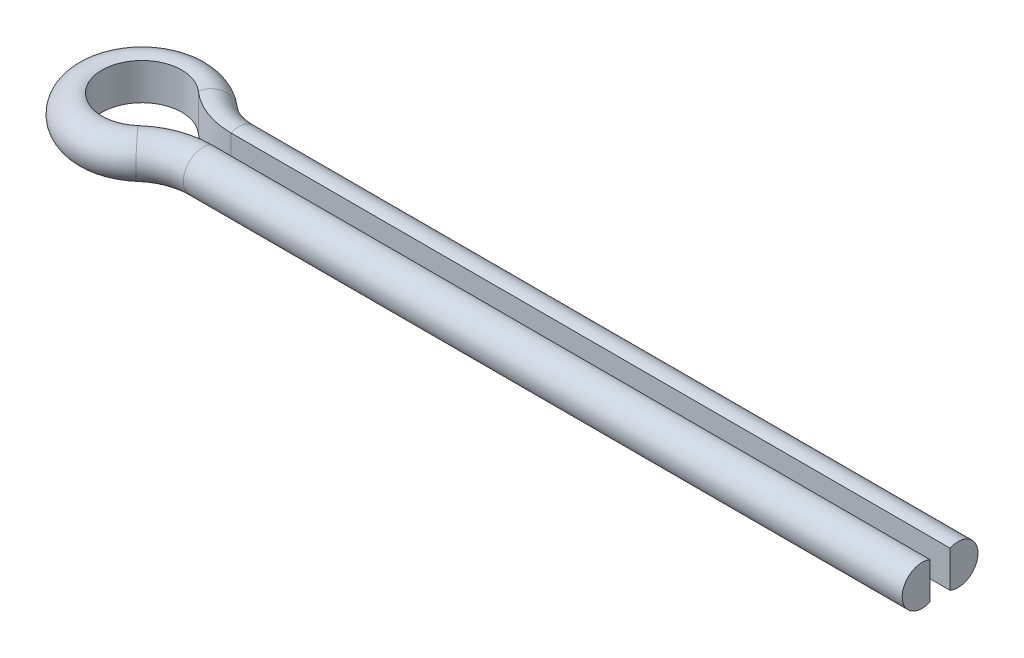
ISO-10303-21;
HEADER;
FILE_DESCRIPTION(('STEP AP214'),'2;1');
FILE_NAME('part.step','',(''),(''),'','','');
FILE_SCHEMA(('AUTOMOTIVE_DESIGN { 1 0 10303 214 1 1 1 1 }'));
ENDSEC;
DATA;
#1=APPLICATION_CONTEXT('core data for automotive mechanical design processes');
#2=APPLICATION_PROTOCOL_DEFINITION('international standard','automotive_design',2000,#1);
#3=PRODUCT_CONTEXT('',#1,'mechanical');
#4=PRODUCT('Part','Part','',(#3));
#5=PRODUCT_RELATED_PRODUCT_CATEGORY('part','',(#4));
#6=PRODUCT_DEFINITION_FORMATION('','',#4);
#7=PRODUCT_DEFINITION_CONTEXT('part definition',#1,'design');
#8=PRODUCT_DEFINITION('design','',#6,#7);
#9=PRODUCT_DEFINITION_SHAPE('','',#8);
#10=(LENGTH_UNIT() NAMED_UNIT(*) SI_UNIT(.MILLI.,.METRE.));
#11=(NAMED_UNIT(*) PLANE_ANGLE_UNIT() SI_UNIT($,.RADIAN.));
#12=(NAMED_UNIT(*) SI_UNIT($,.STERADIAN.) SOLID_ANGLE_UNIT());
#13=UNCERTAINTY_MEASURE_WITH_UNIT(LENGTH_MEASURE(1.E-05),#10,'distance_accuracy_value','');
#14=(GEOMETRIC_REPRESENTATION_CONTEXT(3) GLOBAL_UNCERTAINTY_ASSIGNED_CONTEXT((#13)) GLOBAL_UNIT_ASSIGNED_CONTEXT((#10,
#11,#12)) REPRESENTATION_CONTEXT('',''));
#15=CARTESIAN_POINT('',(0.,0.,0.));
#16=DIRECTION('',(0.,0.,1.));
#17=DIRECTION('',(1.,0.,0.));
#18=AXIS2_PLACEMENT_3D('',#15,#16,#17);
#19=CARTESIAN_POINT('',(100.,0.,2.25));
#20=DIRECTION('',(-1.,0.,0.));
#21=DIRECTION('',(0.,0.,1.));
#22=AXIS2_PLACEMENT_3D('',#19,#20,#21);
#23=PLANE('',#22);
#24=CARTESIAN_POINT('',(100.,0.,2.25));
#25=DIRECTION('',(-1.,0.,0.));
#26=DIRECTION('',(0.,0.,1.));
#27=AXIS2_PLACEMENT_3D('',#24,#25,#26);
#28=CIRCLE('',#27,2.5);
#29=CARTESIAN_POINT('',(100.,-2.29128784747792,1.25));
#30=VERTEX_POINT('',#29);
#31=CARTESIAN_POINT('',(100.,2.29128784747792,1.25));
#32=VERTEX_POINT('',#31);
#33=EDGE_CURVE('E86',#30,#32,#28,.T.);
#34=ORIENTED_EDGE('',*,*,#33,.F.);
#35=DIRECTION('',(0.,-1.,0.));
#36=VECTOR('',#35,1.);
#37=CARTESIAN_POINT('',(100.,2.29128784747792,1.25));
#38=LINE('',#37,#36);
#39=EDGE_CURVE('E88',#32,#30,#38,.T.);
#40=ORIENTED_EDGE('',*,*,#39,.F.);
#41=EDGE_LOOP('',(#34,#40));
#42=FACE_BOUND('',#41,.T.);
#43=ADVANCED_FACE('F39',(#42),#23,.F.);
#44=CARTESIAN_POINT('',(100.,0.,-2.25));
#45=DIRECTION('',(1.,0.,0.));
#46=DIRECTION('',(0.,0.,-1.));
#47=AXIS2_PLACEMENT_3D('',#44,#45,#46);
#48=PLANE('',#47);
#49=CARTESIAN_POINT('',(100.,0.,-2.25));
#50=DIRECTION('',(1.,0.,0.));
#51=DIRECTION('',(0.,0.,-1.));
#52=AXIS2_PLACEMENT_3D('',#49,#50,#51);
#53=CIRCLE('',#52,2.5);
#54=CARTESIAN_POINT('',(100.,-2.29128784747792,-1.25));
#55=VERTEX_POINT('',#54);
#56=CARTESIAN_POINT('',(100.,2.29128784747792,-1.25));
#57=VERTEX_POINT('',#56);
#58=EDGE_CURVE('E52',#55,#57,#53,.T.);
#59=ORIENTED_EDGE('',*,*,#58,.T.);
#60=DIRECTION('',(0.,-1.,0.));
#61=VECTOR('',#60,1.);
#62=CARTESIAN_POINT('',(100.,2.29128784747792,-1.25));
#63=LINE('',#62,#61);
#64=EDGE_CURVE('E11',#57,#55,#63,.T.);
#65=ORIENTED_EDGE('',*,*,#64,.T.);
#66=EDGE_LOOP('',(#59,#65));
#67=FACE_BOUND('',#66,.T.);
#68=ADVANCED_FACE('F212',(#67),#48,.T.);
#69=CARTESIAN_POINT('',(100.,0.,2.25));
#70=DIRECTION('',(-1.,0.,0.));
#71=DIRECTION('',(0.,0.,1.));
#72=AXIS2_PLACEMENT_3D('',#69,#70,#71);
#73=CYLINDRICAL_SURFACE('',#72,2.5);
#74=DIRECTION('',(-1.,0.,0.));
#75=VECTOR('',#74,1.);
#76=CARTESIAN_POINT('',(100.,2.29128784747792,1.25));
#77=LINE('',#76,#75);
#78=CARTESIAN_POINT('',(9.92156741649222,2.29128784747792,1.25));
#79=VERTEX_POINT('',#78);
#80=EDGE_CURVE('E100',#32,#79,#77,.T.);
#81=ORIENTED_EDGE('',*,*,#80,.T.);
#82=CARTESIAN_POINT('',(9.92156741649222,0.,2.25));
#83=DIRECTION('',(-1.,0.,0.));
#84=DIRECTION('',(0.,0.,1.));
#85=AXIS2_PLACEMENT_3D('',#82,#83,#84);
#86=CIRCLE('',#85,2.5);
#87=CARTESIAN_POINT('',(9.92156741649222,-2.29128784747792,1.25));
#88=VERTEX_POINT('',#87);
#89=EDGE_CURVE('E106',#88,#79,#86,.T.);
#90=ORIENTED_EDGE('',*,*,#89,.F.);
#91=DIRECTION('',(-1.,0.,0.));
#92=VECTOR('',#91,1.);
#93=CARTESIAN_POINT('',(100.,-2.29128784747792,1.25));
#94=LINE('',#93,#92);
#95=EDGE_CURVE('E99',#30,#88,#94,.T.);
#96=ORIENTED_EDGE('',*,*,#95,.F.);
#97=ORIENTED_EDGE('',*,*,#33,.T.);
#98=EDGE_LOOP('',(#81,#90,#96,#97));
#99=FACE_BOUND('',#98,.T.);
#100=ADVANCED_FACE('F104',(#99),#73,.T.);
#101=CARTESIAN_POINT('',(100.,2.29128784747792,1.25));
#102=DIRECTION('',(0.,0.,-1.));
#103=DIRECTION('',(-1.,0.,0.));
#104=AXIS2_PLACEMENT_3D('',#101,#102,#103);
#105=PLANE('',#104);
#106=DIRECTION('',(0.,-1.,0.));
#107=VECTOR('',#106,1.);
#108=CARTESIAN_POINT('',(9.92156741649222,2.29128784747792,1.25));
#109=LINE('',#108,#107);
#110=EDGE_CURVE('E126',#79,#88,#109,.T.);
#111=ORIENTED_EDGE('',*,*,#110,.F.);
#112=ORIENTED_EDGE('',*,*,#80,.F.);
#113=ORIENTED_EDGE('',*,*,#39,.T.);
#114=ORIENTED_EDGE('',*,*,#95,.T.);
#115=EDGE_LOOP('',(#111,#112,#113,#114));
#116=FACE_BOUND('',#115,.T.);
#117=ADVANCED_FACE('F98',(#116),#105,.T.);
#118=CARTESIAN_POINT('',(9.92156741649221,0.,11.25));
#119=DIRECTION('',(0.,1.,0.));
#120=DIRECTION('',(0.,0.,1.));
#121=AXIS2_PLACEMENT_3D('',#118,#119,#120);
#122=TOROIDAL_SURFACE('',#121,9.,2.5);
#123=CARTESIAN_POINT('',(9.92156741649221,2.29128784747792,11.25));
#124=DIRECTION('',(0.,1.,0.));
#125=DIRECTION('',(0.,0.,-1.));
#126=AXIS2_PLACEMENT_3D('',#123,#124,#125);
#127=CIRCLE('',#126,10.);
#128=CARTESIAN_POINT('',(3.30718913883074,2.29128784747792,3.75));
#129=VERTEX_POINT('',#128);
#130=EDGE_CURVE('E117',#79,#129,#127,.T.);
#131=ORIENTED_EDGE('',*,*,#130,.T.);
#132=CARTESIAN_POINT('',(3.96862696659689,0.,4.5));
#133=DIRECTION('',(-0.75,0.,0.661437827766147));
#134=DIRECTION('',(0.661437827766148,0.,0.75));
#135=AXIS2_PLACEMENT_3D('',#132,#133,#134);
#136=CIRCLE('',#135,2.5);
#137=CARTESIAN_POINT('',(3.30718913883074,-2.29128784747792,3.75));
#138=VERTEX_POINT('',#137);
#139=EDGE_CURVE('E113',#138,#129,#136,.T.);
#140=ORIENTED_EDGE('',*,*,#139,.F.);
#141=CARTESIAN_POINT('',(9.92156741649221,-2.29128784747792,11.25));
#142=DIRECTION('',(0.,1.,0.));
#143=DIRECTION('',(0.,0.,-1.));
#144=AXIS2_PLACEMENT_3D('',#141,#142,#143);
#145=CIRCLE('',#144,10.);
#146=EDGE_CURVE('E118',#88,#138,#145,.T.);
#147=ORIENTED_EDGE('',*,*,#146,.F.);
#148=ORIENTED_EDGE('',*,*,#89,.T.);
#149=EDGE_LOOP('',(#131,#140,#147,#148));
#150=FACE_BOUND('',#149,.T.);
#151=ADVANCED_FACE('F191',(#150),#122,.T.);
#152=CARTESIAN_POINT('',(9.92156741649221,0.,11.25));
#153=DIRECTION('',(0.,1.,0.));
#154=DIRECTION('',(0.,0.,1.));
#155=AXIS2_PLACEMENT_3D('',#152,#153,#154);
#156=CYLINDRICAL_SURFACE('',#155,10.);
#157=DIRECTION('',(0.,-1.,0.));
#158=VECTOR('',#157,1.);
#159=CARTESIAN_POINT('',(3.30718913883074,2.29128784747792,3.75));
#160=LINE('',#159,#158);
#161=EDGE_CURVE('E122',#129,#138,#160,.T.);
#162=ORIENTED_EDGE('',*,*,#161,.F.);
#163=ORIENTED_EDGE('',*,*,#130,.F.);
#164=ORIENTED_EDGE('',*,*,#110,.T.);
#165=ORIENTED_EDGE('',*,*,#146,.T.);
#166=EDGE_LOOP('',(#162,#163,#164,#165));
#167=FACE_BOUND('',#166,.T.);
#168=ADVANCED_FACE('F192',(#167),#156,.T.);
#169=CARTESIAN_POINT('',(0.,0.,0.));
#170=DIRECTION('',(0.,-1.,0.));
#171=DIRECTION('',(0.,0.,-1.));
#172=AXIS2_PLACEMENT_3D('',#169,#170,#171);
#173=TOROIDAL_SURFACE('',#172,6.,2.5);
#174=CARTESIAN_POINT('',(0.,2.29128784747792,0.));
#175=DIRECTION('',(0.,-1.,0.));
#176=DIRECTION('',(0.661437827766148,0.,0.75));
#177=AXIS2_PLACEMENT_3D('',#174,#175,#176);
#178=CIRCLE('',#177,5.);
#179=CARTESIAN_POINT('',(3.30718913883074,2.29128784747792,-3.75));
#180=VERTEX_POINT('',#179);
#181=EDGE_CURVE('E131',#129,#180,#178,.T.);
#182=ORIENTED_EDGE('',*,*,#181,.T.);
#183=CARTESIAN_POINT('',(3.96862696659689,0.,-4.5));
#184=DIRECTION('',(0.75,0.,0.661437827766147));
#185=DIRECTION('',(0.661437827766147,0.,-0.75));
#186=AXIS2_PLACEMENT_3D('',#183,#184,#185);
#187=CIRCLE('',#186,2.5);
#188=CARTESIAN_POINT('',(3.30718913883074,-2.29128784747792,-3.75));
#189=VERTEX_POINT('',#188);
#190=EDGE_CURVE('E127',#189,#180,#187,.T.);
#191=ORIENTED_EDGE('',*,*,#190,.F.);
#192=CARTESIAN_POINT('',(0.,-2.29128784747792,0.));
#193=DIRECTION('',(0.,-1.,0.));
#194=DIRECTION('',(0.661437827766148,0.,0.75));
#195=AXIS2_PLACEMENT_3D('',#192,#193,#194);
#196=CIRCLE('',#195,5.);
#197=EDGE_CURVE('E132',#138,#189,#196,.T.);
#198=ORIENTED_EDGE('',*,*,#197,.F.);
#199=ORIENTED_EDGE('',*,*,#139,.T.);
#200=EDGE_LOOP('',(#182,#191,#198,#199));
#201=FACE_BOUND('',#200,.T.);
#202=ADVANCED_FACE('F185',(#201),#173,.T.);
#203=CARTESIAN_POINT('',(0.,0.,0.));
#204=DIRECTION('',(0.,-1.,0.));
#205=DIRECTION('',(0.,0.,-1.));
#206=AXIS2_PLACEMENT_3D('',#203,#204,#205);
#207=CYLINDRICAL_SURFACE('',#206,5.);
#208=DIRECTION('',(0.,-1.,0.));
#209=VECTOR('',#208,1.);
#210=CARTESIAN_POINT('',(3.30718913883074,2.29128784747792,-3.75));
#211=LINE('',#210,#209);
#212=EDGE_CURVE('E136',#180,#189,#211,.T.);
#213=ORIENTED_EDGE('',*,*,#212,.F.);
#214=ORIENTED_EDGE('',*,*,#181,.F.);
#215=ORIENTED_EDGE('',*,*,#161,.T.);
#216=ORIENTED_EDGE('',*,*,#197,.T.);
#217=EDGE_LOOP('',(#213,#214,#215,#216));
#218=FACE_BOUND('',#217,.T.);
#219=ADVANCED_FACE('F186',(#218),#207,.F.);
#220=CARTESIAN_POINT('',(9.92156741649221,0.,-11.25));
#221=DIRECTION('',(0.,1.,0.));
#222=DIRECTION('',(0.,0.,1.));
#223=AXIS2_PLACEMENT_3D('',#220,#221,#222);
#224=TOROIDAL_SURFACE('',#223,8.99999999999999,2.5);
#225=CARTESIAN_POINT('',(9.92156741649221,2.29128784747792,-11.25));
#226=DIRECTION('',(0.,1.,0.));
#227=DIRECTION('',(-0.661437827766148,0.,0.75));
#228=AXIS2_PLACEMENT_3D('',#225,#226,#227);
#229=CIRCLE('',#228,9.99999999999999);
#230=CARTESIAN_POINT('',(9.92156741649222,2.29128784747792,-1.25));
#231=VERTEX_POINT('',#230);
#232=EDGE_CURVE('E144',#180,#231,#229,.T.);
#233=ORIENTED_EDGE('',*,*,#232,.T.);
#234=CARTESIAN_POINT('',(9.92156741649222,0.,-2.25));
#235=DIRECTION('',(1.,0.,0.));
#236=DIRECTION('',(0.,0.,-1.));
#237=AXIS2_PLACEMENT_3D('',#234,#235,#236);
#238=CIRCLE('',#237,2.5);
#239=CARTESIAN_POINT('',(9.92156741649222,-2.29128784747792,-1.25));
#240=VERTEX_POINT('',#239);
#241=EDGE_CURVE('E140',#240,#231,#238,.T.);
#242=ORIENTED_EDGE('',*,*,#241,.F.);
#243=CARTESIAN_POINT('',(9.92156741649221,-2.29128784747792,-11.25));
#244=DIRECTION('',(0.,1.,0.));
#245=DIRECTION('',(-0.661437827766148,0.,0.75));
#246=AXIS2_PLACEMENT_3D('',#243,#244,#245);
#247=CIRCLE('',#246,9.99999999999999);
#248=EDGE_CURVE('E145',#189,#240,#247,.T.);
#249=ORIENTED_EDGE('',*,*,#248,.F.);
#250=ORIENTED_EDGE('',*,*,#190,.T.);
#251=EDGE_LOOP('',(#233,#242,#249,#250));
#252=FACE_BOUND('',#251,.T.);
#253=ADVANCED_FACE('F178',(#252),#224,.T.);
#254=CARTESIAN_POINT('',(9.92156741649221,0.,-11.25));
#255=DIRECTION('',(0.,1.,0.));
#256=DIRECTION('',(0.,0.,1.));
#257=AXIS2_PLACEMENT_3D('',#254,#255,#256);
#258=CYLINDRICAL_SURFACE('',#257,9.99999999999999);
#259=DIRECTION('',(0.,-1.,0.));
#260=VECTOR('',#259,1.);
#261=CARTESIAN_POINT('',(9.92156741649222,2.29128784747792,-1.25));
#262=LINE('',#261,#260);
#263=EDGE_CURVE('E149',#231,#240,#262,.T.);
#264=ORIENTED_EDGE('',*,*,#263,.F.);
#265=ORIENTED_EDGE('',*,*,#232,.F.);
#266=ORIENTED_EDGE('',*,*,#212,.T.);
#267=ORIENTED_EDGE('',*,*,#248,.T.);
#268=EDGE_LOOP('',(#264,#265,#266,#267));
#269=FACE_BOUND('',#268,.T.);
#270=ADVANCED_FACE('F180',(#269),#258,.T.);
#271=CARTESIAN_POINT('',(9.92156741649222,0.,-2.25));
#272=DIRECTION('',(1.,0.,0.));
#273=DIRECTION('',(0.,0.,-1.));
#274=AXIS2_PLACEMENT_3D('',#271,#272,#273);
#275=CYLINDRICAL_SURFACE('',#274,2.5);
#276=DIRECTION('',(1.,0.,0.));
#277=VECTOR('',#276,1.);
#278=CARTESIAN_POINT('',(9.92156741649222,2.29128784747792,-1.25));
#279=LINE('',#278,#277);
#280=EDGE_CURVE('E47',#231,#57,#279,.T.);
#281=ORIENTED_EDGE('',*,*,#280,.T.);
#282=ORIENTED_EDGE('',*,*,#58,.F.);
#283=DIRECTION('',(1.,0.,0.));
#284=VECTOR('',#283,1.);
#285=CARTESIAN_POINT('',(9.92156741649222,-2.29128784747792,-1.25));
#286=LINE('',#285,#284);
#287=EDGE_CURVE('E155',#240,#55,#286,.T.);
#288=ORIENTED_EDGE('',*,*,#287,.F.);
#289=ORIENTED_EDGE('',*,*,#241,.T.);
#290=EDGE_LOOP('',(#281,#282,#288,#289));
#291=FACE_BOUND('',#290,.T.);
#292=ADVANCED_FACE('F205',(#291),#275,.T.);
#293=CARTESIAN_POINT('',(9.92156741649222,2.29128784747792,-1.25));
#294=DIRECTION('',(0.,0.,1.));
#295=DIRECTION('',(1.,0.,0.));
#296=AXIS2_PLACEMENT_3D('',#293,#294,#295);
#297=PLANE('',#296);
#298=ORIENTED_EDGE('',*,*,#64,.F.);
#299=ORIENTED_EDGE('',*,*,#280,.F.);
#300=ORIENTED_EDGE('',*,*,#263,.T.);
#301=ORIENTED_EDGE('',*,*,#287,.T.);
#302=EDGE_LOOP('',(#298,#299,#300,#301));
#303=FACE_BOUND('',#302,.T.);
#304=ADVANCED_FACE('F175',(#303),#297,.T.);
#305=CLOSED_SHELL('',(#43,#68,#100,#117,#151,#168,#202,#219,#253,#270,#292,#304));
#306=MANIFOLD_SOLID_BREP('B2',#305);
#307=ADVANCED_BREP_SHAPE_REPRESENTATION('',(#18,#306),#14);
#308=SHAPE_DEFINITION_REPRESENTATION(#9,#307);
ENDSEC;
END-ISO-10303-21;
